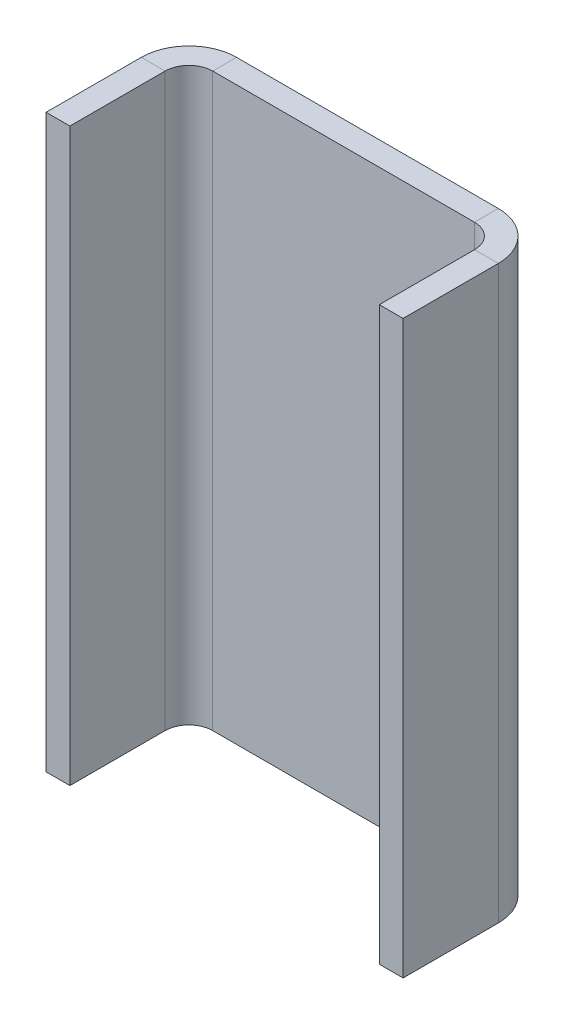
ISO-10303-21;
HEADER;
FILE_DESCRIPTION(('STEP AP214'),'2;1');
FILE_NAME('part.step','',(''),(''),'','','');
FILE_SCHEMA(('AUTOMOTIVE_DESIGN { 1 0 10303 214 1 1 1 1 }'));
ENDSEC;
DATA;
#1=APPLICATION_CONTEXT('core data for automotive mechanical design processes');
#2=APPLICATION_PROTOCOL_DEFINITION('international standard','automotive_design',2000,#1);
#3=PRODUCT_CONTEXT('',#1,'mechanical');
#4=PRODUCT('Part','Part','',(#3));
#5=PRODUCT_RELATED_PRODUCT_CATEGORY('part','',(#4));
#6=PRODUCT_DEFINITION_FORMATION('','',#4);
#7=PRODUCT_DEFINITION_CONTEXT('part definition',#1,'design');
#8=PRODUCT_DEFINITION('design','',#6,#7);
#9=PRODUCT_DEFINITION_SHAPE('','',#8);
#10=(LENGTH_UNIT() NAMED_UNIT(*) SI_UNIT(.MILLI.,.METRE.));
#11=(NAMED_UNIT(*) PLANE_ANGLE_UNIT() SI_UNIT($,.RADIAN.));
#12=(NAMED_UNIT(*) SI_UNIT($,.STERADIAN.) SOLID_ANGLE_UNIT());
#13=UNCERTAINTY_MEASURE_WITH_UNIT(LENGTH_MEASURE(1.E-05),#10,'distance_accuracy_value','');
#14=(GEOMETRIC_REPRESENTATION_CONTEXT(3) GLOBAL_UNCERTAINTY_ASSIGNED_CONTEXT((#13)) GLOBAL_UNIT_ASSIGNED_CONTEXT((#10,
#11,#12)) REPRESENTATION_CONTEXT('',''));
#15=CARTESIAN_POINT('',(0.,0.,0.));
#16=DIRECTION('',(0.,0.,1.));
#17=DIRECTION('',(1.,0.,0.));
#18=AXIS2_PLACEMENT_3D('',#15,#16,#17);
#19=CARTESIAN_POINT('',(0.,0.,-5.));
#20=DIRECTION('',(0.,0.,1.));
#21=DIRECTION('',(1.,0.,0.));
#22=AXIS2_PLACEMENT_3D('',#19,#20,#21);
#23=PLANE('',#22);
#24=DIRECTION('',(0.,-1.,0.));
#25=VECTOR('',#24,1.);
#26=CARTESIAN_POINT('',(-27.5,-120.,-5.00000000000001));
#27=LINE('',#26,#25);
#28=CARTESIAN_POINT('',(-27.5,-120.,-5.00000000000001));
#29=VERTEX_POINT('',#28);
#30=CARTESIAN_POINT('',(-27.5,0.,-5.));
#31=VERTEX_POINT('',#30);
#32=EDGE_CURVE('E171',#29,#31,#27,.F.);
#33=ORIENTED_EDGE('',*,*,#32,.T.);
#34=DIRECTION('',(-1.,0.,0.));
#35=VECTOR('',#34,1.);
#36=CARTESIAN_POINT('',(-32.5,0.,-5.));
#37=LINE('',#36,#35);
#38=CARTESIAN_POINT('',(27.5,0.,-5.));
#39=VERTEX_POINT('',#38);
#40=EDGE_CURVE('E11',#39,#31,#37,.T.);
#41=ORIENTED_EDGE('',*,*,#40,.F.);
#42=DIRECTION('',(0.,1.,0.));
#43=VECTOR('',#42,1.);
#44=CARTESIAN_POINT('',(27.5,0.,-5.));
#45=LINE('',#44,#43);
#46=CARTESIAN_POINT('',(27.5,-120.,-5.));
#47=VERTEX_POINT('',#46);
#48=EDGE_CURVE('E225',#39,#47,#45,.F.);
#49=ORIENTED_EDGE('',*,*,#48,.T.);
#50=DIRECTION('',(1.,0.,0.));
#51=VECTOR('',#50,1.);
#52=CARTESIAN_POINT('',(-32.5,-120.,-5.));
#53=LINE('',#52,#51);
#54=EDGE_CURVE('E51',#29,#47,#53,.T.);
#55=ORIENTED_EDGE('',*,*,#54,.F.);
#56=EDGE_LOOP('',(#33,#41,#49,#55));
#57=FACE_BOUND('',#56,.T.);
#58=ADVANCED_FACE('F42',(#57),#23,.F.);
#59=CARTESIAN_POINT('',(0.,0.,0.));
#60=DIRECTION('',(0.,0.,1.));
#61=DIRECTION('',(1.,0.,0.));
#62=AXIS2_PLACEMENT_3D('',#59,#60,#61);
#63=PLANE('',#62);
#64=DIRECTION('',(-1.,0.,0.));
#65=VECTOR('',#64,1.);
#66=CARTESIAN_POINT('',(-32.5,0.,0.));
#67=LINE('',#66,#65);
#68=CARTESIAN_POINT('',(27.5,0.,0.));
#69=VERTEX_POINT('',#68);
#70=CARTESIAN_POINT('',(-27.5,0.,0.));
#71=VERTEX_POINT('',#70);
#72=EDGE_CURVE('E46',#69,#71,#67,.T.);
#73=ORIENTED_EDGE('',*,*,#72,.T.);
#74=DIRECTION('',(0.,-1.,0.));
#75=VECTOR('',#74,1.);
#76=CARTESIAN_POINT('',(-27.5,-120.,0.));
#77=LINE('',#76,#75);
#78=CARTESIAN_POINT('',(-27.5,-120.,0.));
#79=VERTEX_POINT('',#78);
#80=EDGE_CURVE('E183',#79,#71,#77,.F.);
#81=ORIENTED_EDGE('',*,*,#80,.F.);
#82=DIRECTION('',(1.,0.,0.));
#83=VECTOR('',#82,1.);
#84=CARTESIAN_POINT('',(-32.5,-120.,0.));
#85=LINE('',#84,#83);
#86=CARTESIAN_POINT('',(27.5,-120.,0.));
#87=VERTEX_POINT('',#86);
#88=EDGE_CURVE('E243',#79,#87,#85,.T.);
#89=ORIENTED_EDGE('',*,*,#88,.T.);
#90=DIRECTION('',(0.,1.,0.));
#91=VECTOR('',#90,1.);
#92=CARTESIAN_POINT('',(27.5,0.,0.));
#93=LINE('',#92,#91);
#94=EDGE_CURVE('E59',#69,#87,#93,.F.);
#95=ORIENTED_EDGE('',*,*,#94,.F.);
#96=EDGE_LOOP('',(#73,#81,#89,#95));
#97=FACE_BOUND('',#96,.T.);
#98=ADVANCED_FACE('F247',(#97),#63,.T.);
#99=CARTESIAN_POINT('',(-32.5,-120.,-5.));
#100=DIRECTION('',(0.,-1.,0.));
#101=DIRECTION('',(0.,0.,-1.));
#102=AXIS2_PLACEMENT_3D('',#99,#100,#101);
#103=PLANE('',#102);
#104=ORIENTED_EDGE('',*,*,#88,.F.);
#105=DIRECTION('',(0.,0.,-1.));
#106=VECTOR('',#105,1.);
#107=CARTESIAN_POINT('',(-27.5,-120.,0.));
#108=LINE('',#107,#106);
#109=EDGE_CURVE('E177',#79,#29,#108,.T.);
#110=ORIENTED_EDGE('',*,*,#109,.T.);
#111=ORIENTED_EDGE('',*,*,#54,.T.);
#112=DIRECTION('',(0.,0.,-1.));
#113=VECTOR('',#112,1.);
#114=CARTESIAN_POINT('',(27.5,-120.,0.));
#115=LINE('',#114,#113);
#116=EDGE_CURVE('E240',#87,#47,#115,.T.);
#117=ORIENTED_EDGE('',*,*,#116,.F.);
#118=EDGE_LOOP('',(#104,#110,#111,#117));
#119=FACE_BOUND('',#118,.T.);
#120=ADVANCED_FACE('F44',(#119),#103,.T.);
#121=CARTESIAN_POINT('',(-32.5,0.,-5.));
#122=DIRECTION('',(0.,1.,0.));
#123=DIRECTION('',(0.,0.,1.));
#124=AXIS2_PLACEMENT_3D('',#121,#122,#123);
#125=PLANE('',#124);
#126=DIRECTION('',(0.,0.,-1.));
#127=VECTOR('',#126,1.);
#128=CARTESIAN_POINT('',(-27.5,0.,0.));
#129=LINE('',#128,#127);
#130=EDGE_CURVE('E188',#71,#31,#129,.T.);
#131=ORIENTED_EDGE('',*,*,#130,.F.);
#132=ORIENTED_EDGE('',*,*,#72,.F.);
#133=DIRECTION('',(0.,0.,-1.));
#134=VECTOR('',#133,1.);
#135=CARTESIAN_POINT('',(27.5,0.,0.));
#136=LINE('',#135,#134);
#137=EDGE_CURVE('E231',#69,#39,#136,.T.);
#138=ORIENTED_EDGE('',*,*,#137,.T.);
#139=ORIENTED_EDGE('',*,*,#40,.T.);
#140=EDGE_LOOP('',(#131,#132,#138,#139));
#141=FACE_BOUND('',#140,.T.);
#142=ADVANCED_FACE('F292',(#141),#125,.T.);
#143=CARTESIAN_POINT('',(27.5,-120.,5.));
#144=DIRECTION('',(0.,-1.,0.));
#145=DIRECTION('',(0.,0.,-1.));
#146=AXIS2_PLACEMENT_3D('',#143,#144,#145);
#147=PLANE('',#146);
#148=DIRECTION('',(1.,0.,0.));
#149=VECTOR('',#148,1.);
#150=CARTESIAN_POINT('',(32.5,-120.,4.99999999999998));
#151=LINE('',#150,#149);
#152=CARTESIAN_POINT('',(32.5,-120.,4.99999999999999));
#153=VERTEX_POINT('',#152);
#154=CARTESIAN_POINT('',(37.5,-120.,4.99999999999997));
#155=VERTEX_POINT('',#154);
#156=EDGE_CURVE('E191',#153,#155,#151,.T.);
#157=ORIENTED_EDGE('',*,*,#156,.F.);
#158=CARTESIAN_POINT('',(27.5,-120.,5.));
#159=DIRECTION('',(0.,1.,0.));
#160=DIRECTION('',(0.,0.,1.));
#161=AXIS2_PLACEMENT_3D('',#158,#159,#160);
#162=CIRCLE('',#161,5.);
#163=EDGE_CURVE('E234',#87,#153,#162,.F.);
#164=ORIENTED_EDGE('',*,*,#163,.F.);
#165=ORIENTED_EDGE('',*,*,#116,.T.);
#166=CARTESIAN_POINT('',(27.5,-120.,5.));
#167=DIRECTION('',(0.,1.,0.));
#168=DIRECTION('',(0.,0.,1.));
#169=AXIS2_PLACEMENT_3D('',#166,#167,#168);
#170=CIRCLE('',#169,10.);
#171=EDGE_CURVE('E227',#47,#155,#170,.F.);
#172=ORIENTED_EDGE('',*,*,#171,.T.);
#173=EDGE_LOOP('',(#157,#164,#165,#172));
#174=FACE_BOUND('',#173,.T.);
#175=ADVANCED_FACE('F294',(#174),#147,.T.);
#176=CARTESIAN_POINT('',(27.5,0.,4.99999999999999));
#177=DIRECTION('',(0.,-1.,0.));
#178=DIRECTION('',(0.,0.,-1.));
#179=AXIS2_PLACEMENT_3D('',#176,#177,#178);
#180=PLANE('',#179);
#181=CARTESIAN_POINT('',(27.5,0.,4.99999999999999));
#182=DIRECTION('',(0.,1.,0.));
#183=DIRECTION('',(0.,0.,1.));
#184=AXIS2_PLACEMENT_3D('',#181,#182,#183);
#185=CIRCLE('',#184,5.);
#186=CARTESIAN_POINT('',(32.5,0.,4.99999999999998));
#187=VERTEX_POINT('',#186);
#188=EDGE_CURVE('E222',#187,#69,#185,.T.);
#189=ORIENTED_EDGE('',*,*,#188,.F.);
#190=DIRECTION('',(1.,0.,0.));
#191=VECTOR('',#190,1.);
#192=CARTESIAN_POINT('',(32.5,0.,4.99999999999998));
#193=LINE('',#192,#191);
#194=CARTESIAN_POINT('',(37.5,0.,4.99999999999996));
#195=VERTEX_POINT('',#194);
#196=EDGE_CURVE('E195',#187,#195,#193,.T.);
#197=ORIENTED_EDGE('',*,*,#196,.T.);
#198=CARTESIAN_POINT('',(27.5,0.,4.99999999999999));
#199=DIRECTION('',(0.,1.,0.));
#200=DIRECTION('',(0.,0.,1.));
#201=AXIS2_PLACEMENT_3D('',#198,#199,#200);
#202=CIRCLE('',#201,10.);
#203=EDGE_CURVE('E228',#195,#39,#202,.T.);
#204=ORIENTED_EDGE('',*,*,#203,.T.);
#205=ORIENTED_EDGE('',*,*,#137,.F.);
#206=EDGE_LOOP('',(#189,#197,#204,#205));
#207=FACE_BOUND('',#206,.T.);
#208=ADVANCED_FACE('F290',(#207),#180,.F.);
#209=CARTESIAN_POINT('',(27.5,0.,4.99999999999999));
#210=DIRECTION('',(0.,1.,0.));
#211=DIRECTION('',(1.,0.,0.));
#212=AXIS2_PLACEMENT_3D('',#209,#210,#211);
#213=CYLINDRICAL_SURFACE('',#212,10.);
#214=ORIENTED_EDGE('',*,*,#48,.F.);
#215=ORIENTED_EDGE('',*,*,#203,.F.);
#216=DIRECTION('',(0.,1.,0.));
#217=VECTOR('',#216,1.);
#218=CARTESIAN_POINT('',(37.5,0.,4.99999999999996));
#219=LINE('',#218,#217);
#220=EDGE_CURVE('E198',#155,#195,#219,.T.);
#221=ORIENTED_EDGE('',*,*,#220,.F.);
#222=ORIENTED_EDGE('',*,*,#171,.F.);
#223=EDGE_LOOP('',(#214,#215,#221,#222));
#224=FACE_BOUND('',#223,.T.);
#225=ADVANCED_FACE('F337',(#224),#213,.T.);
#226=CARTESIAN_POINT('',(27.5,0.,4.99999999999999));
#227=DIRECTION('',(0.,1.,0.));
#228=DIRECTION('',(1.,0.,0.));
#229=AXIS2_PLACEMENT_3D('',#226,#227,#228);
#230=CYLINDRICAL_SURFACE('',#229,5.);
#231=ORIENTED_EDGE('',*,*,#94,.T.);
#232=ORIENTED_EDGE('',*,*,#163,.T.);
#233=DIRECTION('',(0.,1.,0.));
#234=VECTOR('',#233,1.);
#235=CARTESIAN_POINT('',(32.5,-120.,4.99999999999998));
#236=LINE('',#235,#234);
#237=EDGE_CURVE('E193',#153,#187,#236,.T.);
#238=ORIENTED_EDGE('',*,*,#237,.T.);
#239=ORIENTED_EDGE('',*,*,#188,.T.);
#240=EDGE_LOOP('',(#231,#232,#238,#239));
#241=FACE_BOUND('',#240,.T.);
#242=ADVANCED_FACE('F329',(#241),#230,.F.);
#243=CARTESIAN_POINT('',(37.5,0.,0.));
#244=DIRECTION('',(0.,1.,0.));
#245=DIRECTION('',(-1.,0.,0.));
#246=AXIS2_PLACEMENT_3D('',#243,#244,#245);
#247=PLANE('',#246);
#248=DIRECTION('',(0.,0.,-1.));
#249=VECTOR('',#248,1.);
#250=CARTESIAN_POINT('',(37.5,0.,0.));
#251=LINE('',#250,#249);
#252=CARTESIAN_POINT('',(37.5000000000001,0.,25.));
#253=VERTEX_POINT('',#252);
#254=EDGE_CURVE('E210',#253,#195,#251,.T.);
#255=ORIENTED_EDGE('',*,*,#254,.T.);
#256=ORIENTED_EDGE('',*,*,#196,.F.);
#257=DIRECTION('',(0.,0.,-1.));
#258=VECTOR('',#257,1.);
#259=CARTESIAN_POINT('',(32.5,0.,0.));
#260=LINE('',#259,#258);
#261=CARTESIAN_POINT('',(32.5000000000001,0.,25.));
#262=VERTEX_POINT('',#261);
#263=EDGE_CURVE('E207',#262,#187,#260,.T.);
#264=ORIENTED_EDGE('',*,*,#263,.F.);
#265=DIRECTION('',(-1.,0.,0.));
#266=VECTOR('',#265,1.);
#267=CARTESIAN_POINT('',(37.5000000000001,0.,25.));
#268=LINE('',#267,#266);
#269=EDGE_CURVE('E220',#253,#262,#268,.T.);
#270=ORIENTED_EDGE('',*,*,#269,.F.);
#271=EDGE_LOOP('',(#255,#256,#264,#270));
#272=FACE_BOUND('',#271,.T.);
#273=ADVANCED_FACE('F326',(#272),#247,.T.);
#274=CARTESIAN_POINT('',(37.5000000000001,-120.,25.));
#275=DIRECTION('',(0.,-1.,0.));
#276=DIRECTION('',(1.,0.,0.));
#277=AXIS2_PLACEMENT_3D('',#274,#275,#276);
#278=PLANE('',#277);
#279=DIRECTION('',(0.,0.,1.));
#280=VECTOR('',#279,1.);
#281=CARTESIAN_POINT('',(32.5000000000001,-120.,25.));
#282=LINE('',#281,#280);
#283=CARTESIAN_POINT('',(32.5000000000001,-120.,25.));
#284=VERTEX_POINT('',#283);
#285=EDGE_CURVE('E203',#153,#284,#282,.T.);
#286=ORIENTED_EDGE('',*,*,#285,.F.);
#287=ORIENTED_EDGE('',*,*,#156,.T.);
#288=DIRECTION('',(0.,0.,1.));
#289=VECTOR('',#288,1.);
#290=CARTESIAN_POINT('',(37.5000000000001,-120.,25.));
#291=LINE('',#290,#289);
#292=CARTESIAN_POINT('',(37.5000000000001,-120.,25.));
#293=VERTEX_POINT('',#292);
#294=EDGE_CURVE('E204',#155,#293,#291,.T.);
#295=ORIENTED_EDGE('',*,*,#294,.T.);
#296=DIRECTION('',(-1.,0.,0.));
#297=VECTOR('',#296,1.);
#298=CARTESIAN_POINT('',(37.5000000000001,-120.,25.));
#299=LINE('',#298,#297);
#300=EDGE_CURVE('E213',#293,#284,#299,.T.);
#301=ORIENTED_EDGE('',*,*,#300,.T.);
#302=EDGE_LOOP('',(#286,#287,#295,#301));
#303=FACE_BOUND('',#302,.T.);
#304=ADVANCED_FACE('F321',(#303),#278,.T.);
#305=CARTESIAN_POINT('',(37.5,0.,-1.34724713670248E-13));
#306=DIRECTION('',(1.,0.,0.));
#307=DIRECTION('',(0.,0.,-1.));
#308=AXIS2_PLACEMENT_3D('',#305,#306,#307);
#309=PLANE('',#308);
#310=ORIENTED_EDGE('',*,*,#294,.F.);
#311=ORIENTED_EDGE('',*,*,#220,.T.);
#312=ORIENTED_EDGE('',*,*,#254,.F.);
#313=DIRECTION('',(0.,1.,0.));
#314=VECTOR('',#313,1.);
#315=CARTESIAN_POINT('',(37.5000000000001,0.,25.));
#316=LINE('',#315,#314);
#317=EDGE_CURVE('E206',#293,#253,#316,.T.);
#318=ORIENTED_EDGE('',*,*,#317,.F.);
#319=EDGE_LOOP('',(#310,#311,#312,#318));
#320=FACE_BOUND('',#319,.T.);
#321=ADVANCED_FACE('F317',(#320),#309,.T.);
#322=CARTESIAN_POINT('',(32.5,0.,-1.17267306976032E-13));
#323=DIRECTION('',(1.,0.,0.));
#324=DIRECTION('',(0.,0.,-1.));
#325=AXIS2_PLACEMENT_3D('',#322,#323,#324);
#326=PLANE('',#325);
#327=ORIENTED_EDGE('',*,*,#237,.F.);
#328=ORIENTED_EDGE('',*,*,#285,.T.);
#329=DIRECTION('',(0.,1.,0.));
#330=VECTOR('',#329,1.);
#331=CARTESIAN_POINT('',(32.5000000000001,0.,25.));
#332=LINE('',#331,#330);
#333=EDGE_CURVE('E215',#284,#262,#332,.T.);
#334=ORIENTED_EDGE('',*,*,#333,.T.);
#335=ORIENTED_EDGE('',*,*,#263,.T.);
#336=EDGE_LOOP('',(#327,#328,#334,#335));
#337=FACE_BOUND('',#336,.T.);
#338=ADVANCED_FACE('F320',(#337),#326,.F.);
#339=CARTESIAN_POINT('',(37.5000000000001,0.,25.));
#340=DIRECTION('',(0.,0.,1.));
#341=DIRECTION('',(1.,0.,0.));
#342=AXIS2_PLACEMENT_3D('',#339,#340,#341);
#343=PLANE('',#342);
#344=ORIENTED_EDGE('',*,*,#333,.F.);
#345=ORIENTED_EDGE('',*,*,#300,.F.);
#346=ORIENTED_EDGE('',*,*,#317,.T.);
#347=ORIENTED_EDGE('',*,*,#269,.T.);
#348=EDGE_LOOP('',(#344,#345,#346,#347));
#349=FACE_BOUND('',#348,.T.);
#350=ADVANCED_FACE('F315',(#349),#343,.T.);
#351=CARTESIAN_POINT('',(-27.5,0.,5.));
#352=DIRECTION('',(0.,1.,0.));
#353=DIRECTION('',(0.,0.,1.));
#354=AXIS2_PLACEMENT_3D('',#351,#352,#353);
#355=PLANE('',#354);
#356=DIRECTION('',(-1.,0.,0.));
#357=VECTOR('',#356,1.);
#358=CARTESIAN_POINT('',(-32.5,0.,4.99999999999998));
#359=LINE('',#358,#357);
#360=CARTESIAN_POINT('',(-32.5,0.,4.99999999999998));
#361=VERTEX_POINT('',#360);
#362=CARTESIAN_POINT('',(-37.5,0.,4.99999999999997));
#363=VERTEX_POINT('',#362);
#364=EDGE_CURVE('E141',#361,#363,#359,.T.);
#365=ORIENTED_EDGE('',*,*,#364,.F.);
#366=CARTESIAN_POINT('',(-27.5,0.,5.));
#367=DIRECTION('',(0.,-1.,0.));
#368=DIRECTION('',(0.,0.,-1.));
#369=AXIS2_PLACEMENT_3D('',#366,#367,#368);
#370=CIRCLE('',#369,5.00000000000001);
#371=EDGE_CURVE('E180',#71,#361,#370,.F.);
#372=ORIENTED_EDGE('',*,*,#371,.F.);
#373=ORIENTED_EDGE('',*,*,#130,.T.);
#374=CARTESIAN_POINT('',(-27.5,0.,5.));
#375=DIRECTION('',(0.,-1.,0.));
#376=DIRECTION('',(0.,0.,-1.));
#377=AXIS2_PLACEMENT_3D('',#374,#375,#376);
#378=CIRCLE('',#377,10.);
#379=EDGE_CURVE('E173',#31,#363,#378,.F.);
#380=ORIENTED_EDGE('',*,*,#379,.T.);
#381=EDGE_LOOP('',(#365,#372,#373,#380));
#382=FACE_BOUND('',#381,.T.);
#383=ADVANCED_FACE('F256',(#382),#355,.T.);
#384=CARTESIAN_POINT('',(-27.5,-120.,5.));
#385=DIRECTION('',(0.,1.,0.));
#386=DIRECTION('',(0.,0.,1.));
#387=AXIS2_PLACEMENT_3D('',#384,#385,#386);
#388=PLANE('',#387);
#389=CARTESIAN_POINT('',(-27.5,-120.,5.));
#390=DIRECTION('',(0.,-1.,0.));
#391=DIRECTION('',(0.,0.,-1.));
#392=AXIS2_PLACEMENT_3D('',#389,#390,#391);
#393=CIRCLE('',#392,5.00000000000001);
#394=CARTESIAN_POINT('',(-32.5,-120.,4.99999999999998));
#395=VERTEX_POINT('',#394);
#396=EDGE_CURVE('E169',#395,#79,#393,.T.);
#397=ORIENTED_EDGE('',*,*,#396,.F.);
#398=DIRECTION('',(-1.,0.,0.));
#399=VECTOR('',#398,1.);
#400=CARTESIAN_POINT('',(-32.5,-120.,4.99999999999998));
#401=LINE('',#400,#399);
#402=CARTESIAN_POINT('',(-37.5,-120.,4.99999999999997));
#403=VERTEX_POINT('',#402);
#404=EDGE_CURVE('E260',#395,#403,#401,.T.);
#405=ORIENTED_EDGE('',*,*,#404,.T.);
#406=CARTESIAN_POINT('',(-27.5,-120.,5.));
#407=DIRECTION('',(0.,-1.,0.));
#408=DIRECTION('',(0.,0.,-1.));
#409=AXIS2_PLACEMENT_3D('',#406,#407,#408);
#410=CIRCLE('',#409,10.);
#411=EDGE_CURVE('E174',#403,#29,#410,.T.);
#412=ORIENTED_EDGE('',*,*,#411,.T.);
#413=ORIENTED_EDGE('',*,*,#109,.F.);
#414=EDGE_LOOP('',(#397,#405,#412,#413));
#415=FACE_BOUND('',#414,.T.);
#416=ADVANCED_FACE('F266',(#415),#388,.F.);
#417=CARTESIAN_POINT('',(-27.5,-120.,5.));
#418=DIRECTION('',(0.,-1.,0.));
#419=DIRECTION('',(-1.,0.,0.));
#420=AXIS2_PLACEMENT_3D('',#417,#418,#419);
#421=CYLINDRICAL_SURFACE('',#420,10.);
#422=ORIENTED_EDGE('',*,*,#32,.F.);
#423=ORIENTED_EDGE('',*,*,#411,.F.);
#424=DIRECTION('',(0.,-1.,0.));
#425=VECTOR('',#424,1.);
#426=CARTESIAN_POINT('',(-37.5,0.,4.99999999999997));
#427=LINE('',#426,#425);
#428=EDGE_CURVE('E165',#363,#403,#427,.T.);
#429=ORIENTED_EDGE('',*,*,#428,.F.);
#430=ORIENTED_EDGE('',*,*,#379,.F.);
#431=EDGE_LOOP('',(#422,#423,#429,#430));
#432=FACE_BOUND('',#431,.T.);
#433=ADVANCED_FACE('F303',(#432),#421,.T.);
#434=CARTESIAN_POINT('',(-27.5,-120.,5.));
#435=DIRECTION('',(0.,-1.,0.));
#436=DIRECTION('',(-1.,0.,0.));
#437=AXIS2_PLACEMENT_3D('',#434,#435,#436);
#438=CYLINDRICAL_SURFACE('',#437,5.00000000000001);
#439=ORIENTED_EDGE('',*,*,#80,.T.);
#440=ORIENTED_EDGE('',*,*,#371,.T.);
#441=DIRECTION('',(0.,-1.,0.));
#442=VECTOR('',#441,1.);
#443=CARTESIAN_POINT('',(-32.5,0.,4.99999999999998));
#444=LINE('',#443,#442);
#445=EDGE_CURVE('E258',#361,#395,#444,.T.);
#446=ORIENTED_EDGE('',*,*,#445,.T.);
#447=ORIENTED_EDGE('',*,*,#396,.T.);
#448=EDGE_LOOP('',(#439,#440,#446,#447));
#449=FACE_BOUND('',#448,.T.);
#450=ADVANCED_FACE('F252',(#449),#438,.F.);
#451=CARTESIAN_POINT('',(-37.5,-120.,0.));
#452=DIRECTION('',(0.,-1.,0.));
#453=DIRECTION('',(1.,0.,0.));
#454=AXIS2_PLACEMENT_3D('',#451,#452,#453);
#455=PLANE('',#454);
#456=DIRECTION('',(0.,0.,-1.));
#457=VECTOR('',#456,1.);
#458=CARTESIAN_POINT('',(-37.5,-120.,0.));
#459=LINE('',#458,#457);
#460=CARTESIAN_POINT('',(-37.5000000000001,-120.,25.));
#461=VERTEX_POINT('',#460);
#462=EDGE_CURVE('E155',#461,#403,#459,.T.);
#463=ORIENTED_EDGE('',*,*,#462,.T.);
#464=ORIENTED_EDGE('',*,*,#404,.F.);
#465=DIRECTION('',(0.,0.,-1.));
#466=VECTOR('',#465,1.);
#467=CARTESIAN_POINT('',(-32.5,-120.,0.));
#468=LINE('',#467,#466);
#469=CARTESIAN_POINT('',(-32.5000000000001,-120.,25.));
#470=VERTEX_POINT('',#469);
#471=EDGE_CURVE('E146',#470,#395,#468,.T.);
#472=ORIENTED_EDGE('',*,*,#471,.F.);
#473=DIRECTION('',(1.,0.,0.));
#474=VECTOR('',#473,1.);
#475=CARTESIAN_POINT('',(-37.5000000000001,-120.,25.));
#476=LINE('',#475,#474);
#477=EDGE_CURVE('E154',#461,#470,#476,.T.);
#478=ORIENTED_EDGE('',*,*,#477,.F.);
#479=EDGE_LOOP('',(#463,#464,#472,#478));
#480=FACE_BOUND('',#479,.T.);
#481=ADVANCED_FACE('F270',(#480),#455,.T.);
#482=CARTESIAN_POINT('',(-37.5000000000001,0.,25.));
#483=DIRECTION('',(0.,1.,0.));
#484=DIRECTION('',(-1.,0.,0.));
#485=AXIS2_PLACEMENT_3D('',#482,#483,#484);
#486=PLANE('',#485);
#487=DIRECTION('',(0.,0.,1.));
#488=VECTOR('',#487,1.);
#489=CARTESIAN_POINT('',(-32.5000000000001,0.,25.));
#490=LINE('',#489,#488);
#491=CARTESIAN_POINT('',(-32.5000000000001,0.,25.));
#492=VERTEX_POINT('',#491);
#493=EDGE_CURVE('E163',#361,#492,#490,.T.);
#494=ORIENTED_EDGE('',*,*,#493,.F.);
#495=ORIENTED_EDGE('',*,*,#364,.T.);
#496=DIRECTION('',(0.,0.,1.));
#497=VECTOR('',#496,1.);
#498=CARTESIAN_POINT('',(-37.5000000000001,0.,25.));
#499=LINE('',#498,#497);
#500=CARTESIAN_POINT('',(-37.5000000000001,0.,25.));
#501=VERTEX_POINT('',#500);
#502=EDGE_CURVE('E135',#363,#501,#499,.T.);
#503=ORIENTED_EDGE('',*,*,#502,.T.);
#504=DIRECTION('',(1.,0.,0.));
#505=VECTOR('',#504,1.);
#506=CARTESIAN_POINT('',(-37.5000000000001,0.,25.));
#507=LINE('',#506,#505);
#508=EDGE_CURVE('E139',#501,#492,#507,.T.);
#509=ORIENTED_EDGE('',*,*,#508,.T.);
#510=EDGE_LOOP('',(#494,#495,#503,#509));
#511=FACE_BOUND('',#510,.T.);
#512=ADVANCED_FACE('F138',(#511),#486,.T.);
#513=CARTESIAN_POINT('',(-37.5,0.,-1.34724713670248E-13));
#514=DIRECTION('',(-1.,0.,0.));
#515=DIRECTION('',(0.,0.,1.));
#516=AXIS2_PLACEMENT_3D('',#513,#514,#515);
#517=PLANE('',#516);
#518=ORIENTED_EDGE('',*,*,#502,.F.);
#519=ORIENTED_EDGE('',*,*,#428,.T.);
#520=ORIENTED_EDGE('',*,*,#462,.F.);
#521=DIRECTION('',(0.,-1.,0.));
#522=VECTOR('',#521,1.);
#523=CARTESIAN_POINT('',(-37.5000000000001,-120.,25.));
#524=LINE('',#523,#522);
#525=EDGE_CURVE('E145',#501,#461,#524,.T.);
#526=ORIENTED_EDGE('',*,*,#525,.F.);
#527=EDGE_LOOP('',(#518,#519,#520,#526));
#528=FACE_BOUND('',#527,.T.);
#529=ADVANCED_FACE('F157',(#528),#517,.T.);
#530=CARTESIAN_POINT('',(-32.5,0.,-1.17267306976032E-13));
#531=DIRECTION('',(-1.,0.,0.));
#532=DIRECTION('',(0.,0.,1.));
#533=AXIS2_PLACEMENT_3D('',#530,#531,#532);
#534=PLANE('',#533);
#535=ORIENTED_EDGE('',*,*,#445,.F.);
#536=ORIENTED_EDGE('',*,*,#493,.T.);
#537=DIRECTION('',(0.,-1.,0.));
#538=VECTOR('',#537,1.);
#539=CARTESIAN_POINT('',(-32.5000000000001,-120.,25.));
#540=LINE('',#539,#538);
#541=EDGE_CURVE('E153',#492,#470,#540,.T.);
#542=ORIENTED_EDGE('',*,*,#541,.T.);
#543=ORIENTED_EDGE('',*,*,#471,.T.);
#544=EDGE_LOOP('',(#535,#536,#542,#543));
#545=FACE_BOUND('',#544,.T.);
#546=ADVANCED_FACE('F272',(#545),#534,.F.);
#547=CARTESIAN_POINT('',(-37.5000000000001,-120.,25.));
#548=DIRECTION('',(0.,0.,1.));
#549=DIRECTION('',(1.,0.,0.));
#550=AXIS2_PLACEMENT_3D('',#547,#548,#549);
#551=PLANE('',#550);
#552=ORIENTED_EDGE('',*,*,#541,.F.);
#553=ORIENTED_EDGE('',*,*,#508,.F.);
#554=ORIENTED_EDGE('',*,*,#525,.T.);
#555=ORIENTED_EDGE('',*,*,#477,.T.);
#556=EDGE_LOOP('',(#552,#553,#554,#555));
#557=FACE_BOUND('',#556,.T.);
#558=ADVANCED_FACE('F150',(#557),#551,.T.);
#559=CLOSED_SHELL('',(#58,#98,#120,#142,#175,#208,#225,#242,#273,#304,#321,#338,#350,#383,#416,
#433,#450,#481,#512,#529,#546,#558));
#560=MANIFOLD_SOLID_BREP('B2',#559);
#561=ADVANCED_BREP_SHAPE_REPRESENTATION('',(#18,#560),#14);
#562=SHAPE_DEFINITION_REPRESENTATION(#9,#561);
ENDSEC;
END-ISO-10303-21;
